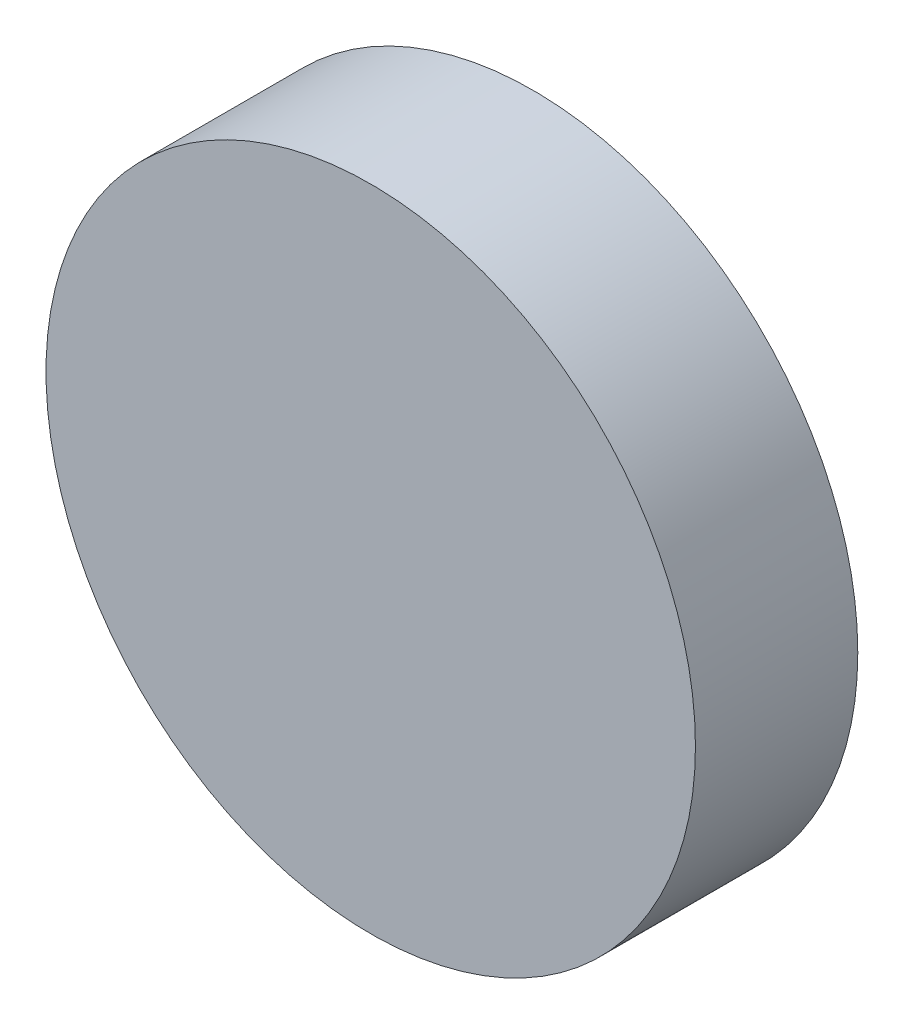
ISO-10303-21;
HEADER;
FILE_DESCRIPTION(('STEP AP214'),'2;1');
FILE_NAME('part.step','',(''),(''),'','','');
FILE_SCHEMA(('AUTOMOTIVE_DESIGN { 1 0 10303 214 1 1 1 1 }'));
ENDSEC;
DATA;
#1=APPLICATION_CONTEXT('core data for automotive mechanical design processes');
#2=APPLICATION_PROTOCOL_DEFINITION('international standard','automotive_design',2000,#1);
#3=PRODUCT_CONTEXT('',#1,'mechanical');
#4=PRODUCT('Part','Part','',(#3));
#5=PRODUCT_RELATED_PRODUCT_CATEGORY('part','',(#4));
#6=PRODUCT_DEFINITION_FORMATION('','',#4);
#7=PRODUCT_DEFINITION_CONTEXT('part definition',#1,'design');
#8=PRODUCT_DEFINITION('design','',#6,#7);
#9=PRODUCT_DEFINITION_SHAPE('','',#8);
#10=(LENGTH_UNIT() NAMED_UNIT(*) SI_UNIT(.MILLI.,.METRE.));
#11=(NAMED_UNIT(*) PLANE_ANGLE_UNIT() SI_UNIT($,.RADIAN.));
#12=(NAMED_UNIT(*) SI_UNIT($,.STERADIAN.) SOLID_ANGLE_UNIT());
#13=UNCERTAINTY_MEASURE_WITH_UNIT(LENGTH_MEASURE(1.E-05),#10,'distance_accuracy_value','');
#14=(GEOMETRIC_REPRESENTATION_CONTEXT(3) GLOBAL_UNCERTAINTY_ASSIGNED_CONTEXT((#13)) GLOBAL_UNIT_ASSIGNED_CONTEXT((#10,
#11,#12)) REPRESENTATION_CONTEXT('',''));
#15=CARTESIAN_POINT('',(0.,0.,0.));
#16=DIRECTION('',(0.,0.,1.));
#17=DIRECTION('',(1.,0.,0.));
#18=AXIS2_PLACEMENT_3D('',#15,#16,#17);
#19=CARTESIAN_POINT('',(0.,0.,12.7));
#20=DIRECTION('',(0.,0.,-1.));
#21=DIRECTION('',(-1.,0.,0.));
#22=AXIS2_PLACEMENT_3D('',#19,#20,#21);
#23=CYLINDRICAL_SURFACE('',#22,23.876);
#24=CARTESIAN_POINT('',(0.,0.,0.));
#25=DIRECTION('',(0.,0.,1.));
#26=DIRECTION('',(1.,0.,0.));
#27=AXIS2_PLACEMENT_3D('',#24,#25,#26);
#28=CIRCLE('',#27,23.876);
#29=CARTESIAN_POINT('',(23.876,0.,0.));
#30=VERTEX_POINT('',#29);
#31=EDGE_CURVE('E50',#30,#30,#28,.T.);
#32=ORIENTED_EDGE('',*,*,#31,.F.);
#33=EDGE_LOOP('',(#32));
#34=FACE_BOUND('',#33,.T.);
#35=CARTESIAN_POINT('',(0.,0.,10.16));
#36=DIRECTION('',(0.,0.,1.));
#37=DIRECTION('',(1.,0.,0.));
#38=AXIS2_PLACEMENT_3D('',#35,#36,#37);
#39=CIRCLE('',#38,23.876);
#40=CARTESIAN_POINT('',(23.876,0.,10.16));
#41=VERTEX_POINT('',#40);
#42=EDGE_CURVE('E55',#41,#41,#39,.T.);
#43=ORIENTED_EDGE('',*,*,#42,.T.);
#44=EDGE_LOOP('',(#43));
#45=FACE_BOUND('',#44,.T.);
#46=ADVANCED_FACE('F37',(#34,#45),#23,.F.);
#47=CARTESIAN_POINT('',(0.,0.,12.7));
#48=DIRECTION('',(0.,0.,1.));
#49=DIRECTION('',(1.,0.,0.));
#50=AXIS2_PLACEMENT_3D('',#47,#48,#49);
#51=PLANE('',#50);
#52=CARTESIAN_POINT('',(0.,0.,12.7));
#53=DIRECTION('',(0.,0.,1.));
#54=DIRECTION('',(1.,0.,0.));
#55=AXIS2_PLACEMENT_3D('',#52,#53,#54);
#56=CIRCLE('',#55,25.4);
#57=CARTESIAN_POINT('',(25.4,0.,12.7));
#58=VERTEX_POINT('',#57);
#59=EDGE_CURVE('E10',#58,#58,#56,.T.);
#60=ORIENTED_EDGE('',*,*,#59,.T.);
#61=EDGE_LOOP('',(#60));
#62=FACE_BOUND('',#61,.T.);
#63=ADVANCED_FACE('F71',(#62),#51,.T.);
#64=CARTESIAN_POINT('',(0.,0.,0.));
#65=DIRECTION('',(0.,0.,1.));
#66=DIRECTION('',(1.,0.,0.));
#67=AXIS2_PLACEMENT_3D('',#64,#65,#66);
#68=PLANE('',#67);
#69=CARTESIAN_POINT('',(0.,0.,0.));
#70=DIRECTION('',(0.,0.,1.));
#71=DIRECTION('',(1.,0.,0.));
#72=AXIS2_PLACEMENT_3D('',#69,#70,#71);
#73=CIRCLE('',#72,25.4);
#74=CARTESIAN_POINT('',(25.4,0.,0.));
#75=VERTEX_POINT('',#74);
#76=EDGE_CURVE('E41',#75,#75,#73,.T.);
#77=ORIENTED_EDGE('',*,*,#76,.F.);
#78=EDGE_LOOP('',(#77));
#79=FACE_BOUND('',#78,.T.);
#80=ORIENTED_EDGE('',*,*,#31,.T.);
#81=EDGE_LOOP('',(#80));
#82=FACE_BOUND('',#81,.T.);
#83=ADVANCED_FACE('F67',(#79,#82),#68,.F.);
#84=CARTESIAN_POINT('',(0.,0.,12.7));
#85=DIRECTION('',(0.,0.,-1.));
#86=DIRECTION('',(-1.,0.,0.));
#87=AXIS2_PLACEMENT_3D('',#84,#85,#86);
#88=CYLINDRICAL_SURFACE('',#87,25.4);
#89=ORIENTED_EDGE('',*,*,#59,.F.);
#90=EDGE_LOOP('',(#89));
#91=FACE_BOUND('',#90,.T.);
#92=ORIENTED_EDGE('',*,*,#76,.T.);
#93=EDGE_LOOP('',(#92));
#94=FACE_BOUND('',#93,.T.);
#95=ADVANCED_FACE('F39',(#91,#94),#88,.T.);
#96=CARTESIAN_POINT('',(0.,0.,10.16));
#97=DIRECTION('',(0.,0.,1.));
#98=DIRECTION('',(1.,0.,0.));
#99=AXIS2_PLACEMENT_3D('',#96,#97,#98);
#100=PLANE('',#99);
#101=ORIENTED_EDGE('',*,*,#42,.F.);
#102=EDGE_LOOP('',(#101));
#103=FACE_BOUND('',#102,.T.);
#104=ADVANCED_FACE('F61',(#103),#100,.F.);
#105=CLOSED_SHELL('',(#46,#63,#83,#95,#104));
#106=MANIFOLD_SOLID_BREP('B2',#105);
#107=ADVANCED_BREP_SHAPE_REPRESENTATION('',(#18,#106),#14);
#108=SHAPE_DEFINITION_REPRESENTATION(#9,#107);
ENDSEC;
END-ISO-10303-21;
